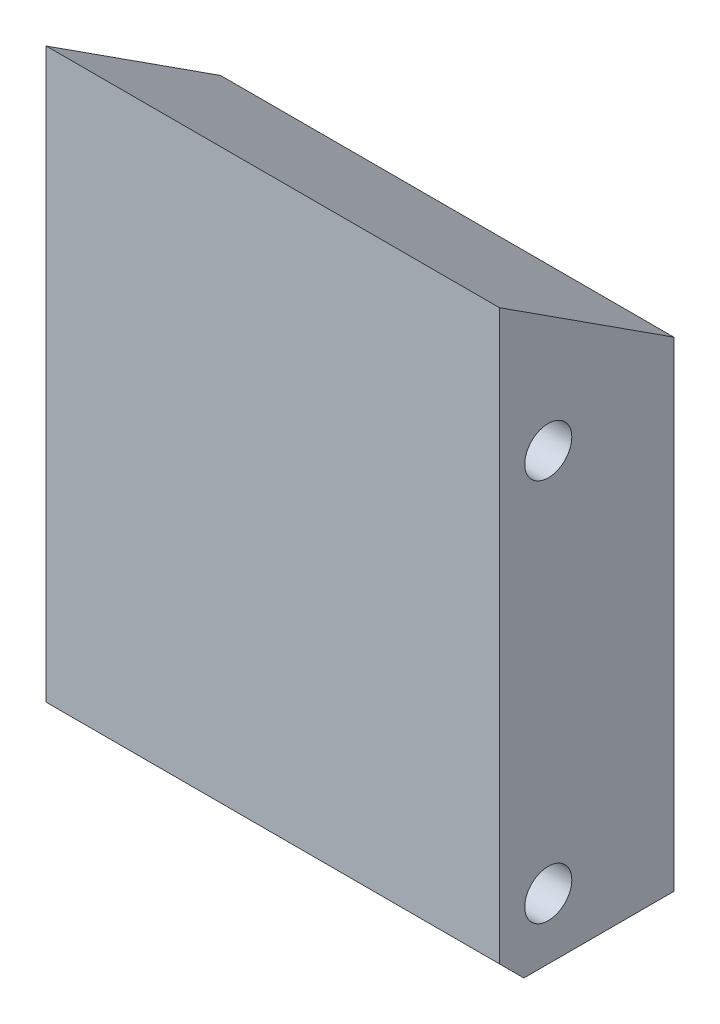
ISO-10303-21;
HEADER;
FILE_DESCRIPTION(('STEP AP214'),'2;1');
FILE_NAME('part.step','',(''),(''),'','','');
FILE_SCHEMA(('AUTOMOTIVE_DESIGN { 1 0 10303 214 1 1 1 1 }'));
ENDSEC;
DATA;
#1=APPLICATION_CONTEXT('core data for automotive mechanical design processes');
#2=APPLICATION_PROTOCOL_DEFINITION('international standard','automotive_design',2000,#1);
#3=PRODUCT_CONTEXT('',#1,'mechanical');
#4=PRODUCT('Part','Part','',(#3));
#5=PRODUCT_RELATED_PRODUCT_CATEGORY('part','',(#4));
#6=PRODUCT_DEFINITION_FORMATION('','',#4);
#7=PRODUCT_DEFINITION_CONTEXT('part definition',#1,'design');
#8=PRODUCT_DEFINITION('design','',#6,#7);
#9=PRODUCT_DEFINITION_SHAPE('','',#8);
#10=(LENGTH_UNIT() NAMED_UNIT(*) SI_UNIT(.MILLI.,.METRE.));
#11=(NAMED_UNIT(*) PLANE_ANGLE_UNIT() SI_UNIT($,.RADIAN.));
#12=(NAMED_UNIT(*) SI_UNIT($,.STERADIAN.) SOLID_ANGLE_UNIT());
#13=UNCERTAINTY_MEASURE_WITH_UNIT(LENGTH_MEASURE(1.E-05),#10,'distance_accuracy_value','');
#14=(GEOMETRIC_REPRESENTATION_CONTEXT(3) GLOBAL_UNCERTAINTY_ASSIGNED_CONTEXT((#13)) GLOBAL_UNIT_ASSIGNED_CONTEXT((#10,
#11,#12)) REPRESENTATION_CONTEXT('',''));
#15=CARTESIAN_POINT('',(0.,0.,0.));
#16=DIRECTION('',(0.,0.,1.));
#17=DIRECTION('',(1.,0.,0.));
#18=AXIS2_PLACEMENT_3D('',#15,#16,#17);
#19=CARTESIAN_POINT('',(13.,-17.,10.));
#20=DIRECTION('',(-1.,0.,0.));
#21=DIRECTION('',(0.,0.,1.));
#22=AXIS2_PLACEMENT_3D('',#19,#20,#21);
#23=PLANE('',#22);
#24=CARTESIAN_POINT('',(13.,8.5,7.2));
#25=DIRECTION('',(1.,0.,0.));
#26=DIRECTION('',(0.,0.,-1.));
#27=AXIS2_PLACEMENT_3D('',#24,#25,#26);
#28=CIRCLE('',#27,1.35);
#29=CARTESIAN_POINT('',(13.,8.5,5.85));
#30=VERTEX_POINT('',#29);
#31=EDGE_CURVE('E177',#30,#30,#28,.T.);
#32=ORIENTED_EDGE('',*,*,#31,.F.);
#33=EDGE_LOOP('',(#32));
#34=FACE_BOUND('',#33,.T.);
#35=CARTESIAN_POINT('',(13.,-13.5,7.2));
#36=DIRECTION('',(1.,0.,0.));
#37=DIRECTION('',(0.,0.,-1.));
#38=AXIS2_PLACEMENT_3D('',#35,#36,#37);
#39=CIRCLE('',#38,1.35);
#40=CARTESIAN_POINT('',(13.,-13.5,5.85));
#41=VERTEX_POINT('',#40);
#42=EDGE_CURVE('E168',#41,#41,#39,.T.);
#43=ORIENTED_EDGE('',*,*,#42,.F.);
#44=EDGE_LOOP('',(#43));
#45=FACE_BOUND('',#44,.T.);
#46=DIRECTION('',(0.,1.,0.));
#47=VECTOR('',#46,1.);
#48=CARTESIAN_POINT('',(13.,-17.,0.));
#49=LINE('',#48,#47);
#50=CARTESIAN_POINT('',(13.,-17.,0.));
#51=VERTEX_POINT('',#50);
#52=CARTESIAN_POINT('',(13.,10.5380701904615,0.));
#53=VERTEX_POINT('',#52);
#54=EDGE_CURVE('E104',#51,#53,#49,.T.);
#55=ORIENTED_EDGE('',*,*,#54,.T.);
#56=DIRECTION('',(0.,-0.542738573627253,-0.839901685137645));
#57=VECTOR('',#56,1.);
#58=CARTESIAN_POINT('',(13.,10.5380701904615,0.));
#59=LINE('',#58,#57);
#60=CARTESIAN_POINT('',(13.,17.,10.));
#61=VERTEX_POINT('',#60);
#62=EDGE_CURVE('E58',#61,#53,#59,.T.);
#63=ORIENTED_EDGE('',*,*,#62,.F.);
#64=DIRECTION('',(0.,1.,0.));
#65=VECTOR('',#64,1.);
#66=CARTESIAN_POINT('',(13.,-17.,10.));
#67=LINE('',#66,#65);
#68=CARTESIAN_POINT('',(13.,-15.6,10.));
#69=VERTEX_POINT('',#68);
#70=EDGE_CURVE('E98',#69,#61,#67,.T.);
#71=ORIENTED_EDGE('',*,*,#70,.F.);
#72=DIRECTION('',(0.,0.707106781186548,0.707106781186548));
#73=VECTOR('',#72,1.);
#74=CARTESIAN_POINT('',(13.,-15.6,10.));
#75=LINE('',#74,#73);
#76=CARTESIAN_POINT('',(13.,-17.,8.6));
#77=VERTEX_POINT('',#76);
#78=EDGE_CURVE('E137',#69,#77,#75,.F.);
#79=ORIENTED_EDGE('',*,*,#78,.T.);
#80=DIRECTION('',(0.,0.,-1.));
#81=VECTOR('',#80,1.);
#82=CARTESIAN_POINT('',(13.,-17.,10.));
#83=LINE('',#82,#81);
#84=EDGE_CURVE('E125',#77,#51,#83,.T.);
#85=ORIENTED_EDGE('',*,*,#84,.T.);
#86=EDGE_LOOP('',(#55,#63,#71,#79,#85));
#87=FACE_BOUND('',#86,.T.);
#88=ADVANCED_FACE('F41',(#34,#45,#87),#23,.F.);
#89=CARTESIAN_POINT('',(-13.,-17.,10.));
#90=DIRECTION('',(1.,0.,0.));
#91=DIRECTION('',(0.,0.,-1.));
#92=AXIS2_PLACEMENT_3D('',#89,#90,#91);
#93=PLANE('',#92);
#94=CARTESIAN_POINT('',(-13.,8.5,7.2));
#95=DIRECTION('',(-1.,0.,0.));
#96=DIRECTION('',(0.,0.,1.));
#97=AXIS2_PLACEMENT_3D('',#94,#95,#96);
#98=CIRCLE('',#97,1.025);
#99=CARTESIAN_POINT('',(-13.,8.5,8.225));
#100=VERTEX_POINT('',#99);
#101=EDGE_CURVE('E161',#100,#100,#98,.T.);
#102=ORIENTED_EDGE('',*,*,#101,.F.);
#103=EDGE_LOOP('',(#102));
#104=FACE_BOUND('',#103,.T.);
#105=CARTESIAN_POINT('',(-13.,-13.5,7.2));
#106=DIRECTION('',(-1.,0.,0.));
#107=DIRECTION('',(0.,0.,1.));
#108=AXIS2_PLACEMENT_3D('',#105,#106,#107);
#109=CIRCLE('',#108,1.025);
#110=CARTESIAN_POINT('',(-13.,-13.5,8.225));
#111=VERTEX_POINT('',#110);
#112=EDGE_CURVE('E152',#111,#111,#109,.T.);
#113=ORIENTED_EDGE('',*,*,#112,.F.);
#114=EDGE_LOOP('',(#113));
#115=FACE_BOUND('',#114,.T.);
#116=DIRECTION('',(0.,-1.,0.));
#117=VECTOR('',#116,1.);
#118=CARTESIAN_POINT('',(-13.,-17.,10.));
#119=LINE('',#118,#117);
#120=CARTESIAN_POINT('',(-13.,17.,10.));
#121=VERTEX_POINT('',#120);
#122=CARTESIAN_POINT('',(-13.,-15.6,10.));
#123=VERTEX_POINT('',#122);
#124=EDGE_CURVE('E97',#121,#123,#119,.T.);
#125=ORIENTED_EDGE('',*,*,#124,.F.);
#126=DIRECTION('',(0.,-0.542738573627253,-0.839901685137645));
#127=VECTOR('',#126,1.);
#128=CARTESIAN_POINT('',(-13.,10.5380701904615,0.));
#129=LINE('',#128,#127);
#130=CARTESIAN_POINT('',(-13.,10.5380701904615,0.));
#131=VERTEX_POINT('',#130);
#132=EDGE_CURVE('E91',#121,#131,#129,.T.);
#133=ORIENTED_EDGE('',*,*,#132,.T.);
#134=DIRECTION('',(0.,-1.,0.));
#135=VECTOR('',#134,1.);
#136=CARTESIAN_POINT('',(-13.,-17.,0.));
#137=LINE('',#136,#135);
#138=CARTESIAN_POINT('',(-13.,-17.,0.));
#139=VERTEX_POINT('',#138);
#140=EDGE_CURVE('E117',#131,#139,#137,.T.);
#141=ORIENTED_EDGE('',*,*,#140,.T.);
#142=DIRECTION('',(0.,0.,-1.));
#143=VECTOR('',#142,1.);
#144=CARTESIAN_POINT('',(-13.,-17.,10.));
#145=LINE('',#144,#143);
#146=CARTESIAN_POINT('',(-13.,-17.,8.6));
#147=VERTEX_POINT('',#146);
#148=EDGE_CURVE('E132',#147,#139,#145,.T.);
#149=ORIENTED_EDGE('',*,*,#148,.F.);
#150=DIRECTION('',(0.,-0.707106781186548,-0.707106781186548));
#151=VECTOR('',#150,1.);
#152=CARTESIAN_POINT('',(-13.,-15.6,10.));
#153=LINE('',#152,#151);
#154=EDGE_CURVE('E11',#147,#123,#153,.F.);
#155=ORIENTED_EDGE('',*,*,#154,.T.);
#156=EDGE_LOOP('',(#125,#133,#141,#149,#155));
#157=FACE_BOUND('',#156,.T.);
#158=ADVANCED_FACE('F145',(#104,#115,#157),#93,.F.);
#159=CARTESIAN_POINT('',(-13.,-17.,10.));
#160=DIRECTION('',(0.,1.,0.));
#161=DIRECTION('',(0.,0.,1.));
#162=AXIS2_PLACEMENT_3D('',#159,#160,#161);
#163=PLANE('',#162);
#164=ORIENTED_EDGE('',*,*,#84,.F.);
#165=DIRECTION('',(-1.,0.,0.));
#166=VECTOR('',#165,1.);
#167=CARTESIAN_POINT('',(-13.,-17.,8.6));
#168=LINE('',#167,#166);
#169=EDGE_CURVE('E51',#77,#147,#168,.T.);
#170=ORIENTED_EDGE('',*,*,#169,.T.);
#171=ORIENTED_EDGE('',*,*,#148,.T.);
#172=DIRECTION('',(1.,0.,0.));
#173=VECTOR('',#172,1.);
#174=CARTESIAN_POINT('',(-13.,-17.,0.));
#175=LINE('',#174,#173);
#176=EDGE_CURVE('E113',#139,#51,#175,.T.);
#177=ORIENTED_EDGE('',*,*,#176,.T.);
#178=EDGE_LOOP('',(#164,#170,#171,#177));
#179=FACE_BOUND('',#178,.T.);
#180=ADVANCED_FACE('F141',(#179),#163,.F.);
#181=CARTESIAN_POINT('',(0.,0.,10.));
#182=DIRECTION('',(0.,0.,-1.));
#183=DIRECTION('',(-1.,0.,0.));
#184=AXIS2_PLACEMENT_3D('',#181,#182,#183);
#185=PLANE('',#184);
#186=ORIENTED_EDGE('',*,*,#124,.T.);
#187=DIRECTION('',(1.,0.,0.));
#188=VECTOR('',#187,1.);
#189=CARTESIAN_POINT('',(0.,-15.6,10.));
#190=LINE('',#189,#188);
#191=EDGE_CURVE('E111',#123,#69,#190,.T.);
#192=ORIENTED_EDGE('',*,*,#191,.T.);
#193=ORIENTED_EDGE('',*,*,#70,.T.);
#194=DIRECTION('',(-1.,0.,0.));
#195=VECTOR('',#194,1.);
#196=CARTESIAN_POINT('',(-13.,17.,10.));
#197=LINE('',#196,#195);
#198=EDGE_CURVE('E88',#61,#121,#197,.T.);
#199=ORIENTED_EDGE('',*,*,#198,.T.);
#200=EDGE_LOOP('',(#186,#192,#193,#199));
#201=FACE_BOUND('',#200,.T.);
#202=ADVANCED_FACE('F109',(#201),#185,.F.);
#203=CARTESIAN_POINT('',(0.,0.,0.));
#204=DIRECTION('',(0.,0.,-1.));
#205=DIRECTION('',(-1.,0.,0.));
#206=AXIS2_PLACEMENT_3D('',#203,#204,#205);
#207=PLANE('',#206);
#208=CARTESIAN_POINT('',(-7.,0.,0.));
#209=DIRECTION('',(0.,0.,-1.));
#210=DIRECTION('',(-1.,0.,0.));
#211=AXIS2_PLACEMENT_3D('',#208,#209,#210);
#212=CIRCLE('',#211,1.35);
#213=CARTESIAN_POINT('',(-8.35,0.,0.));
#214=VERTEX_POINT('',#213);
#215=EDGE_CURVE('E208',#214,#214,#212,.T.);
#216=ORIENTED_EDGE('',*,*,#215,.F.);
#217=EDGE_LOOP('',(#216));
#218=FACE_BOUND('',#217,.T.);
#219=CARTESIAN_POINT('',(0.,-7.,0.));
#220=DIRECTION('',(0.,0.,-1.));
#221=DIRECTION('',(-1.,0.,0.));
#222=AXIS2_PLACEMENT_3D('',#219,#220,#221);
#223=CIRCLE('',#222,1.35);
#224=CARTESIAN_POINT('',(-1.34999999999998,-7.,0.));
#225=VERTEX_POINT('',#224);
#226=EDGE_CURVE('E200',#225,#225,#223,.T.);
#227=ORIENTED_EDGE('',*,*,#226,.F.);
#228=EDGE_LOOP('',(#227));
#229=FACE_BOUND('',#228,.T.);
#230=CARTESIAN_POINT('',(7.,0.,0.));
#231=DIRECTION('',(0.,0.,-1.));
#232=DIRECTION('',(-1.,0.,0.));
#233=AXIS2_PLACEMENT_3D('',#230,#231,#232);
#234=CIRCLE('',#233,1.35);
#235=CARTESIAN_POINT('',(5.65,0.,0.));
#236=VERTEX_POINT('',#235);
#237=EDGE_CURVE('E192',#236,#236,#234,.T.);
#238=ORIENTED_EDGE('',*,*,#237,.F.);
#239=EDGE_LOOP('',(#238));
#240=FACE_BOUND('',#239,.T.);
#241=CARTESIAN_POINT('',(0.,7.,0.));
#242=DIRECTION('',(0.,0.,-1.));
#243=DIRECTION('',(-1.,0.,0.));
#244=AXIS2_PLACEMENT_3D('',#241,#242,#243);
#245=CIRCLE('',#244,1.35);
#246=CARTESIAN_POINT('',(-1.35000000000007,7.,0.));
#247=VERTEX_POINT('',#246);
#248=EDGE_CURVE('E184',#247,#247,#245,.T.);
#249=ORIENTED_EDGE('',*,*,#248,.F.);
#250=EDGE_LOOP('',(#249));
#251=FACE_BOUND('',#250,.T.);
#252=DIRECTION('',(1.,0.,0.));
#253=VECTOR('',#252,1.);
#254=CARTESIAN_POINT('',(-13.,10.5380701904615,0.));
#255=LINE('',#254,#253);
#256=EDGE_CURVE('E120',#131,#53,#255,.T.);
#257=ORIENTED_EDGE('',*,*,#256,.T.);
#258=ORIENTED_EDGE('',*,*,#54,.F.);
#259=ORIENTED_EDGE('',*,*,#176,.F.);
#260=ORIENTED_EDGE('',*,*,#140,.F.);
#261=EDGE_LOOP('',(#257,#258,#259,#260));
#262=FACE_BOUND('',#261,.T.);
#263=ADVANCED_FACE('F148',(#218,#229,#240,#251,#262),#207,.T.);
#264=CARTESIAN_POINT('',(0.,-15.6,10.));
#265=DIRECTION('',(0.,0.707106781186547,-0.707106781186547));
#266=DIRECTION('',(1.,0.,0.));
#267=AXIS2_PLACEMENT_3D('',#264,#265,#266);
#268=PLANE('',#267);
#269=ORIENTED_EDGE('',*,*,#154,.F.);
#270=ORIENTED_EDGE('',*,*,#169,.F.);
#271=ORIENTED_EDGE('',*,*,#78,.F.);
#272=ORIENTED_EDGE('',*,*,#191,.F.);
#273=EDGE_LOOP('',(#269,#270,#271,#272));
#274=FACE_BOUND('',#273,.T.);
#275=ADVANCED_FACE('F44',(#274),#268,.F.);
#276=CARTESIAN_POINT('',(-13.,10.5380701904615,0.));
#277=DIRECTION('',(0.,-0.839901685137645,0.542738573627253));
#278=DIRECTION('',(0.,-0.542738573627253,-0.839901685137645));
#279=AXIS2_PLACEMENT_3D('',#276,#277,#278);
#280=PLANE('',#279);
#281=ORIENTED_EDGE('',*,*,#256,.F.);
#282=ORIENTED_EDGE('',*,*,#132,.F.);
#283=ORIENTED_EDGE('',*,*,#198,.F.);
#284=ORIENTED_EDGE('',*,*,#62,.T.);
#285=EDGE_LOOP('',(#281,#282,#283,#284));
#286=FACE_BOUND('',#285,.T.);
#287=ADVANCED_FACE('F89',(#286),#280,.F.);
#288=CARTESIAN_POINT('',(-3.,-13.5,7.2));
#289=DIRECTION('',(-1.,0.,0.));
#290=DIRECTION('',(0.,0.,1.));
#291=AXIS2_PLACEMENT_3D('',#288,#289,#290);
#292=CYLINDRICAL_SURFACE('',#291,1.025);
#293=CARTESIAN_POINT('',(-3.,-13.5,7.2));
#294=DIRECTION('',(-1.,0.,0.));
#295=DIRECTION('',(0.,0.,1.));
#296=AXIS2_PLACEMENT_3D('',#293,#294,#295);
#297=CIRCLE('',#296,1.025);
#298=CARTESIAN_POINT('',(-3.,-13.5,8.225));
#299=VERTEX_POINT('',#298);
#300=EDGE_CURVE('E156',#299,#299,#297,.T.);
#301=ORIENTED_EDGE('',*,*,#300,.F.);
#302=EDGE_LOOP('',(#301));
#303=FACE_BOUND('',#302,.T.);
#304=ORIENTED_EDGE('',*,*,#112,.T.);
#305=EDGE_LOOP('',(#304));
#306=FACE_BOUND('',#305,.T.);
#307=ADVANCED_FACE('F267',(#303,#306),#292,.F.);
#308=CARTESIAN_POINT('',(-3.,-13.5,7.2));
#309=DIRECTION('',(-1.,0.,0.));
#310=DIRECTION('',(0.,0.,1.));
#311=AXIS2_PLACEMENT_3D('',#308,#309,#310);
#312=PLANE('',#311);
#313=ORIENTED_EDGE('',*,*,#300,.T.);
#314=EDGE_LOOP('',(#313));
#315=FACE_BOUND('',#314,.T.);
#316=ADVANCED_FACE('F270',(#315),#312,.T.);
#317=CARTESIAN_POINT('',(-3.,8.5,7.2));
#318=DIRECTION('',(-1.,0.,0.));
#319=DIRECTION('',(0.,0.,1.));
#320=AXIS2_PLACEMENT_3D('',#317,#318,#319);
#321=CYLINDRICAL_SURFACE('',#320,1.025);
#322=CARTESIAN_POINT('',(-3.,8.5,7.2));
#323=DIRECTION('',(-1.,0.,0.));
#324=DIRECTION('',(0.,0.,1.));
#325=AXIS2_PLACEMENT_3D('',#322,#323,#324);
#326=CIRCLE('',#325,1.025);
#327=CARTESIAN_POINT('',(-3.,8.5,8.225));
#328=VERTEX_POINT('',#327);
#329=EDGE_CURVE('E106',#328,#328,#326,.T.);
#330=ORIENTED_EDGE('',*,*,#329,.F.);
#331=EDGE_LOOP('',(#330));
#332=FACE_BOUND('',#331,.T.);
#333=ORIENTED_EDGE('',*,*,#101,.T.);
#334=EDGE_LOOP('',(#333));
#335=FACE_BOUND('',#334,.T.);
#336=ADVANCED_FACE('F274',(#332,#335),#321,.F.);
#337=CARTESIAN_POINT('',(-3.,8.5,7.2));
#338=DIRECTION('',(-1.,0.,0.));
#339=DIRECTION('',(0.,0.,1.));
#340=AXIS2_PLACEMENT_3D('',#337,#338,#339);
#341=PLANE('',#340);
#342=ORIENTED_EDGE('',*,*,#329,.T.);
#343=EDGE_LOOP('',(#342));
#344=FACE_BOUND('',#343,.T.);
#345=ADVANCED_FACE('F278',(#344),#341,.T.);
#346=CARTESIAN_POINT('',(3.,-13.5,7.2));
#347=DIRECTION('',(1.,0.,0.));
#348=DIRECTION('',(0.,0.,-1.));
#349=AXIS2_PLACEMENT_3D('',#346,#347,#348);
#350=CYLINDRICAL_SURFACE('',#349,1.35);
#351=CARTESIAN_POINT('',(3.,-13.5,7.2));
#352=DIRECTION('',(1.,0.,0.));
#353=DIRECTION('',(0.,0.,-1.));
#354=AXIS2_PLACEMENT_3D('',#351,#352,#353);
#355=CIRCLE('',#354,1.35);
#356=CARTESIAN_POINT('',(3.,-13.5,5.85));
#357=VERTEX_POINT('',#356);
#358=EDGE_CURVE('E172',#357,#357,#355,.T.);
#359=ORIENTED_EDGE('',*,*,#358,.F.);
#360=EDGE_LOOP('',(#359));
#361=FACE_BOUND('',#360,.T.);
#362=ORIENTED_EDGE('',*,*,#42,.T.);
#363=EDGE_LOOP('',(#362));
#364=FACE_BOUND('',#363,.T.);
#365=ADVANCED_FACE('F282',(#361,#364),#350,.F.);
#366=CARTESIAN_POINT('',(3.,-13.5,7.2));
#367=DIRECTION('',(1.,0.,0.));
#368=DIRECTION('',(0.,0.,-1.));
#369=AXIS2_PLACEMENT_3D('',#366,#367,#368);
#370=PLANE('',#369);
#371=ORIENTED_EDGE('',*,*,#358,.T.);
#372=EDGE_LOOP('',(#371));
#373=FACE_BOUND('',#372,.T.);
#374=ADVANCED_FACE('F286',(#373),#370,.T.);
#375=CARTESIAN_POINT('',(3.,8.5,7.2));
#376=DIRECTION('',(1.,0.,0.));
#377=DIRECTION('',(0.,0.,-1.));
#378=AXIS2_PLACEMENT_3D('',#375,#376,#377);
#379=CYLINDRICAL_SURFACE('',#378,1.35);
#380=CARTESIAN_POINT('',(3.,8.5,7.2));
#381=DIRECTION('',(1.,0.,0.));
#382=DIRECTION('',(0.,0.,-1.));
#383=AXIS2_PLACEMENT_3D('',#380,#381,#382);
#384=CIRCLE('',#383,1.35);
#385=CARTESIAN_POINT('',(3.,8.5,5.85));
#386=VERTEX_POINT('',#385);
#387=EDGE_CURVE('E157',#386,#386,#384,.T.);
#388=ORIENTED_EDGE('',*,*,#387,.F.);
#389=EDGE_LOOP('',(#388));
#390=FACE_BOUND('',#389,.T.);
#391=ORIENTED_EDGE('',*,*,#31,.T.);
#392=EDGE_LOOP('',(#391));
#393=FACE_BOUND('',#392,.T.);
#394=ADVANCED_FACE('F247',(#390,#393),#379,.F.);
#395=CARTESIAN_POINT('',(3.,8.5,7.2));
#396=DIRECTION('',(1.,0.,0.));
#397=DIRECTION('',(0.,0.,-1.));
#398=AXIS2_PLACEMENT_3D('',#395,#396,#397);
#399=PLANE('',#398);
#400=ORIENTED_EDGE('',*,*,#387,.T.);
#401=EDGE_LOOP('',(#400));
#402=FACE_BOUND('',#401,.T.);
#403=ADVANCED_FACE('F237',(#402),#399,.T.);
#404=CARTESIAN_POINT('',(0.,7.,4.));
#405=DIRECTION('',(0.,0.,-1.));
#406=DIRECTION('',(-1.,0.,0.));
#407=AXIS2_PLACEMENT_3D('',#404,#405,#406);
#408=CYLINDRICAL_SURFACE('',#407,1.35);
#409=CARTESIAN_POINT('',(0.,7.,4.));
#410=DIRECTION('',(0.,0.,-1.));
#411=DIRECTION('',(-1.,0.,0.));
#412=AXIS2_PLACEMENT_3D('',#409,#410,#411);
#413=CIRCLE('',#412,1.35);
#414=CARTESIAN_POINT('',(-1.35000000000007,7.,4.));
#415=VERTEX_POINT('',#414);
#416=EDGE_CURVE('E188',#415,#415,#413,.T.);
#417=ORIENTED_EDGE('',*,*,#416,.F.);
#418=EDGE_LOOP('',(#417));
#419=FACE_BOUND('',#418,.T.);
#420=ORIENTED_EDGE('',*,*,#248,.T.);
#421=EDGE_LOOP('',(#420));
#422=FACE_BOUND('',#421,.T.);
#423=ADVANCED_FACE('F234',(#419,#422),#408,.F.);
#424=CARTESIAN_POINT('',(0.,7.,4.));
#425=DIRECTION('',(0.,0.,-1.));
#426=DIRECTION('',(-1.,0.,0.));
#427=AXIS2_PLACEMENT_3D('',#424,#425,#426);
#428=PLANE('',#427);
#429=ORIENTED_EDGE('',*,*,#416,.T.);
#430=EDGE_LOOP('',(#429));
#431=FACE_BOUND('',#430,.T.);
#432=ADVANCED_FACE('F236',(#431),#428,.T.);
#433=CARTESIAN_POINT('',(7.,0.,4.));
#434=DIRECTION('',(0.,0.,-1.));
#435=DIRECTION('',(-1.,0.,0.));
#436=AXIS2_PLACEMENT_3D('',#433,#434,#435);
#437=CYLINDRICAL_SURFACE('',#436,1.35);
#438=CARTESIAN_POINT('',(7.,0.,4.));
#439=DIRECTION('',(0.,0.,-1.));
#440=DIRECTION('',(-1.,0.,0.));
#441=AXIS2_PLACEMENT_3D('',#438,#439,#440);
#442=CIRCLE('',#441,1.35);
#443=CARTESIAN_POINT('',(5.65,0.,4.));
#444=VERTEX_POINT('',#443);
#445=EDGE_CURVE('E196',#444,#444,#442,.T.);
#446=ORIENTED_EDGE('',*,*,#445,.F.);
#447=EDGE_LOOP('',(#446));
#448=FACE_BOUND('',#447,.T.);
#449=ORIENTED_EDGE('',*,*,#237,.T.);
#450=EDGE_LOOP('',(#449));
#451=FACE_BOUND('',#450,.T.);
#452=ADVANCED_FACE('F244',(#448,#451),#437,.F.);
#453=CARTESIAN_POINT('',(7.,0.,4.));
#454=DIRECTION('',(0.,0.,-1.));
#455=DIRECTION('',(-1.,0.,0.));
#456=AXIS2_PLACEMENT_3D('',#453,#454,#455);
#457=PLANE('',#456);
#458=ORIENTED_EDGE('',*,*,#445,.T.);
#459=EDGE_LOOP('',(#458));
#460=FACE_BOUND('',#459,.T.);
#461=ADVANCED_FACE('F331',(#460),#457,.T.);
#462=CARTESIAN_POINT('',(0.,-7.,4.));
#463=DIRECTION('',(0.,0.,-1.));
#464=DIRECTION('',(-1.,0.,0.));
#465=AXIS2_PLACEMENT_3D('',#462,#463,#464);
#466=CYLINDRICAL_SURFACE('',#465,1.35);
#467=CARTESIAN_POINT('',(0.,-7.,4.));
#468=DIRECTION('',(0.,0.,-1.));
#469=DIRECTION('',(-1.,0.,0.));
#470=AXIS2_PLACEMENT_3D('',#467,#468,#469);
#471=CIRCLE('',#470,1.35);
#472=CARTESIAN_POINT('',(-1.34999999999998,-7.,4.));
#473=VERTEX_POINT('',#472);
#474=EDGE_CURVE('E204',#473,#473,#471,.T.);
#475=ORIENTED_EDGE('',*,*,#474,.F.);
#476=EDGE_LOOP('',(#475));
#477=FACE_BOUND('',#476,.T.);
#478=ORIENTED_EDGE('',*,*,#226,.T.);
#479=EDGE_LOOP('',(#478));
#480=FACE_BOUND('',#479,.T.);
#481=ADVANCED_FACE('F341',(#477,#480),#466,.F.);
#482=CARTESIAN_POINT('',(0.,-7.,4.));
#483=DIRECTION('',(0.,0.,-1.));
#484=DIRECTION('',(-1.,0.,0.));
#485=AXIS2_PLACEMENT_3D('',#482,#483,#484);
#486=PLANE('',#485);
#487=ORIENTED_EDGE('',*,*,#474,.T.);
#488=EDGE_LOOP('',(#487));
#489=FACE_BOUND('',#488,.T.);
#490=ADVANCED_FACE('F221',(#489),#486,.T.);
#491=CARTESIAN_POINT('',(-7.,0.,4.));
#492=DIRECTION('',(0.,0.,-1.));
#493=DIRECTION('',(-1.,0.,0.));
#494=AXIS2_PLACEMENT_3D('',#491,#492,#493);
#495=CYLINDRICAL_SURFACE('',#494,1.35);
#496=CARTESIAN_POINT('',(-7.,0.,4.));
#497=DIRECTION('',(0.,0.,-1.));
#498=DIRECTION('',(-1.,0.,0.));
#499=AXIS2_PLACEMENT_3D('',#496,#497,#498);
#500=CIRCLE('',#499,1.35);
#501=CARTESIAN_POINT('',(-8.35,0.,4.));
#502=VERTEX_POINT('',#501);
#503=EDGE_CURVE('E173',#502,#502,#500,.T.);
#504=ORIENTED_EDGE('',*,*,#503,.F.);
#505=EDGE_LOOP('',(#504));
#506=FACE_BOUND('',#505,.T.);
#507=ORIENTED_EDGE('',*,*,#215,.T.);
#508=EDGE_LOOP('',(#507));
#509=FACE_BOUND('',#508,.T.);
#510=ADVANCED_FACE('F218',(#506,#509),#495,.F.);
#511=CARTESIAN_POINT('',(-7.,0.,4.));
#512=DIRECTION('',(0.,0.,-1.));
#513=DIRECTION('',(-1.,0.,0.));
#514=AXIS2_PLACEMENT_3D('',#511,#512,#513);
#515=PLANE('',#514);
#516=ORIENTED_EDGE('',*,*,#503,.T.);
#517=EDGE_LOOP('',(#516));
#518=FACE_BOUND('',#517,.T.);
#519=ADVANCED_FACE('F216',(#518),#515,.T.);
#520=CLOSED_SHELL('',(#88,#158,#180,#202,#263,#275,#287,#307,#316,#336,#345,#365,#374,#394,#403,
#423,#432,#452,#461,#481,#490,#510,#519));
#521=MANIFOLD_SOLID_BREP('B2',#520);
#522=ADVANCED_BREP_SHAPE_REPRESENTATION('',(#18,#521),#14);
#523=SHAPE_DEFINITION_REPRESENTATION(#9,#522);
ENDSEC;
END-ISO-10303-21;
